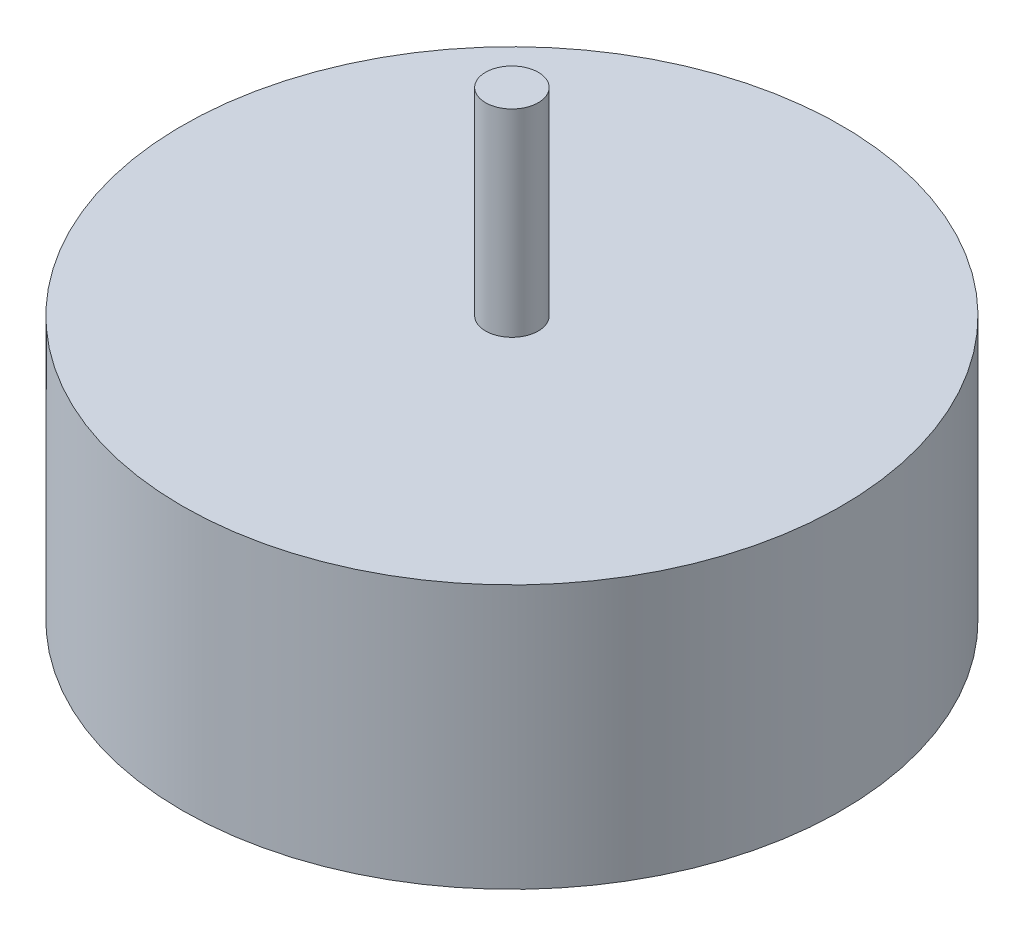
ISO-10303-21;
HEADER;
FILE_DESCRIPTION(('STEP AP214'),'2;1');
FILE_NAME('part.step','',(''),(''),'','','');
FILE_SCHEMA(('AUTOMOTIVE_DESIGN { 1 0 10303 214 1 1 1 1 }'));
ENDSEC;
DATA;
#1=APPLICATION_CONTEXT('core data for automotive mechanical design processes');
#2=APPLICATION_PROTOCOL_DEFINITION('international standard','automotive_design',2000,#1);
#3=PRODUCT_CONTEXT('',#1,'mechanical');
#4=PRODUCT('Part','Part','',(#3));
#5=PRODUCT_RELATED_PRODUCT_CATEGORY('part','',(#4));
#6=PRODUCT_DEFINITION_FORMATION('','',#4);
#7=PRODUCT_DEFINITION_CONTEXT('part definition',#1,'design');
#8=PRODUCT_DEFINITION('design','',#6,#7);
#9=PRODUCT_DEFINITION_SHAPE('','',#8);
#10=(LENGTH_UNIT() NAMED_UNIT(*) SI_UNIT(.MILLI.,.METRE.));
#11=(NAMED_UNIT(*) PLANE_ANGLE_UNIT() SI_UNIT($,.RADIAN.));
#12=(NAMED_UNIT(*) SI_UNIT($,.STERADIAN.) SOLID_ANGLE_UNIT());
#13=UNCERTAINTY_MEASURE_WITH_UNIT(LENGTH_MEASURE(1.E-05),#10,'distance_accuracy_value','');
#14=(GEOMETRIC_REPRESENTATION_CONTEXT(3) GLOBAL_UNCERTAINTY_ASSIGNED_CONTEXT((#13)) GLOBAL_UNIT_ASSIGNED_CONTEXT((#10,
#11,#12)) REPRESENTATION_CONTEXT('',''));
#15=CARTESIAN_POINT('',(0.,0.,0.));
#16=DIRECTION('',(0.,0.,1.));
#17=DIRECTION('',(1.,0.,0.));
#18=AXIS2_PLACEMENT_3D('',#15,#16,#17);
#19=CARTESIAN_POINT('',(0.,50.,0.));
#20=DIRECTION('',(0.,1.,0.));
#21=DIRECTION('',(0.,0.,1.));
#22=AXIS2_PLACEMENT_3D('',#19,#20,#21);
#23=CYLINDRICAL_SURFACE('',#22,4.00000000000001);
#24=CARTESIAN_POINT('',(0.,50.,0.));
#25=DIRECTION('',(0.,1.,0.));
#26=DIRECTION('',(0.,0.,1.));
#27=AXIS2_PLACEMENT_3D('',#24,#25,#26);
#28=CIRCLE('',#27,4.);
#29=CARTESIAN_POINT('',(0.,50.,4.));
#30=VERTEX_POINT('',#29);
#31=EDGE_CURVE('E10',#30,#30,#28,.T.);
#32=ORIENTED_EDGE('',*,*,#31,.F.);
#33=EDGE_LOOP('',(#32));
#34=FACE_BOUND('',#33,.T.);
#35=CARTESIAN_POINT('',(0.,20.,0.));
#36=DIRECTION('',(0.,1.,0.));
#37=DIRECTION('',(0.,0.,1.));
#38=AXIS2_PLACEMENT_3D('',#35,#36,#37);
#39=CIRCLE('',#38,4.00000000000001);
#40=CARTESIAN_POINT('',(0.,20.,4.00000000000001));
#41=VERTEX_POINT('',#40);
#42=EDGE_CURVE('E57',#41,#41,#39,.T.);
#43=ORIENTED_EDGE('',*,*,#42,.T.);
#44=EDGE_LOOP('',(#43));
#45=FACE_BOUND('',#44,.T.);
#46=ADVANCED_FACE('F35',(#34,#45),#23,.T.);
#47=CARTESIAN_POINT('',(0.,50.,0.));
#48=DIRECTION('',(0.,-1.,0.));
#49=DIRECTION('',(0.,0.,-1.));
#50=AXIS2_PLACEMENT_3D('',#47,#48,#49);
#51=PLANE('',#50);
#52=ORIENTED_EDGE('',*,*,#31,.T.);
#53=EDGE_LOOP('',(#52));
#54=FACE_BOUND('',#53,.T.);
#55=ADVANCED_FACE('F85',(#54),#51,.F.);
#56=CARTESIAN_POINT('',(0.,-50.,0.));
#57=DIRECTION('',(0.,-1.,0.));
#58=DIRECTION('',(0.,0.,-1.));
#59=AXIS2_PLACEMENT_3D('',#56,#57,#58);
#60=PLANE('',#59);
#61=CARTESIAN_POINT('',(0.,-50.,0.));
#62=DIRECTION('',(0.,1.,0.));
#63=DIRECTION('',(0.,0.,1.));
#64=AXIS2_PLACEMENT_3D('',#61,#62,#63);
#65=CIRCLE('',#64,4.);
#66=CARTESIAN_POINT('',(0.,-50.,4.));
#67=VERTEX_POINT('',#66);
#68=EDGE_CURVE('E41',#67,#67,#65,.T.);
#69=ORIENTED_EDGE('',*,*,#68,.F.);
#70=EDGE_LOOP('',(#69));
#71=FACE_BOUND('',#70,.T.);
#72=ADVANCED_FACE('F82',(#71),#60,.T.);
#73=CARTESIAN_POINT('',(0.,50.,0.));
#74=DIRECTION('',(0.,1.,0.));
#75=DIRECTION('',(0.,0.,1.));
#76=AXIS2_PLACEMENT_3D('',#73,#74,#75);
#77=CYLINDRICAL_SURFACE('',#76,4.00000000000001);
#78=ORIENTED_EDGE('',*,*,#68,.T.);
#79=EDGE_LOOP('',(#78));
#80=FACE_BOUND('',#79,.T.);
#81=CARTESIAN_POINT('',(0.,-20.,0.));
#82=DIRECTION('',(0.,1.,0.));
#83=DIRECTION('',(0.,0.,1.));
#84=AXIS2_PLACEMENT_3D('',#81,#82,#83);
#85=CIRCLE('',#84,4.00000000000001);
#86=CARTESIAN_POINT('',(0.,-20.,4.00000000000001));
#87=VERTEX_POINT('',#86);
#88=EDGE_CURVE('E45',#87,#87,#85,.T.);
#89=ORIENTED_EDGE('',*,*,#88,.F.);
#90=EDGE_LOOP('',(#89));
#91=FACE_BOUND('',#90,.T.);
#92=ADVANCED_FACE('F76',(#80,#91),#77,.T.);
#93=CARTESIAN_POINT('',(0.,-20.,0.));
#94=DIRECTION('',(0.,-1.,0.));
#95=DIRECTION('',(0.,0.,-1.));
#96=AXIS2_PLACEMENT_3D('',#93,#94,#95);
#97=PLANE('',#96);
#98=ORIENTED_EDGE('',*,*,#88,.T.);
#99=EDGE_LOOP('',(#98));
#100=FACE_BOUND('',#99,.T.);
#101=CARTESIAN_POINT('',(0.,-20.,0.));
#102=DIRECTION('',(0.,1.,0.));
#103=DIRECTION('',(0.,0.,1.));
#104=AXIS2_PLACEMENT_3D('',#101,#102,#103);
#105=CIRCLE('',#104,50.);
#106=CARTESIAN_POINT('',(0.,-20.,50.));
#107=VERTEX_POINT('',#106);
#108=EDGE_CURVE('E49',#107,#107,#105,.T.);
#109=ORIENTED_EDGE('',*,*,#108,.F.);
#110=EDGE_LOOP('',(#109));
#111=FACE_BOUND('',#110,.T.);
#112=ADVANCED_FACE('F71',(#100,#111),#97,.T.);
#113=CARTESIAN_POINT('',(0.,50.,0.));
#114=DIRECTION('',(0.,1.,0.));
#115=DIRECTION('',(0.,0.,1.));
#116=AXIS2_PLACEMENT_3D('',#113,#114,#115);
#117=CYLINDRICAL_SURFACE('',#116,50.);
#118=CARTESIAN_POINT('',(0.,20.,0.));
#119=DIRECTION('',(0.,1.,0.));
#120=DIRECTION('',(0.,0.,1.));
#121=AXIS2_PLACEMENT_3D('',#118,#119,#120);
#122=CIRCLE('',#121,50.);
#123=CARTESIAN_POINT('',(0.,20.,50.));
#124=VERTEX_POINT('',#123);
#125=EDGE_CURVE('E54',#124,#124,#122,.T.);
#126=ORIENTED_EDGE('',*,*,#125,.F.);
#127=EDGE_LOOP('',(#126));
#128=FACE_BOUND('',#127,.T.);
#129=ORIENTED_EDGE('',*,*,#108,.T.);
#130=EDGE_LOOP('',(#129));
#131=FACE_BOUND('',#130,.T.);
#132=ADVANCED_FACE('F65',(#128,#131),#117,.T.);
#133=CARTESIAN_POINT('',(0.,20.,0.));
#134=DIRECTION('',(0.,-1.,0.));
#135=DIRECTION('',(0.,0.,-1.));
#136=AXIS2_PLACEMENT_3D('',#133,#134,#135);
#137=PLANE('',#136);
#138=ORIENTED_EDGE('',*,*,#42,.F.);
#139=EDGE_LOOP('',(#138));
#140=FACE_BOUND('',#139,.T.);
#141=ORIENTED_EDGE('',*,*,#125,.T.);
#142=EDGE_LOOP('',(#141));
#143=FACE_BOUND('',#142,.T.);
#144=ADVANCED_FACE('F62',(#140,#143),#137,.F.);
#145=CLOSED_SHELL('',(#46,#55,#72,#92,#112,#132,#144));
#146=MANIFOLD_SOLID_BREP('B2',#145);
#147=ADVANCED_BREP_SHAPE_REPRESENTATION('',(#18,#146),#14);
#148=SHAPE_DEFINITION_REPRESENTATION(#9,#147);
ENDSEC;
END-ISO-10303-21;
